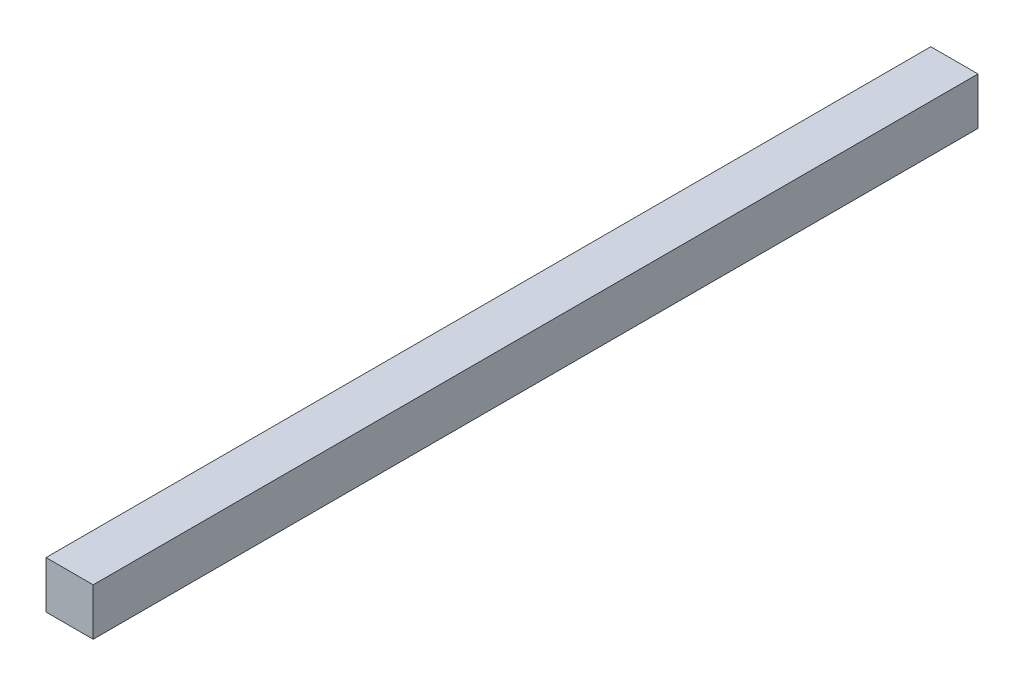
ISO-10303-21;
HEADER;
FILE_DESCRIPTION(('STEP AP214'),'2;1');
FILE_NAME('part.step','',(''),(''),'','','');
FILE_SCHEMA(('AUTOMOTIVE_DESIGN { 1 0 10303 214 1 1 1 1 }'));
ENDSEC;
DATA;
#1=APPLICATION_CONTEXT('core data for automotive mechanical design processes');
#2=APPLICATION_PROTOCOL_DEFINITION('international standard','automotive_design',2000,#1);
#3=PRODUCT_CONTEXT('',#1,'mechanical');
#4=PRODUCT('Part','Part','',(#3));
#5=PRODUCT_RELATED_PRODUCT_CATEGORY('part','',(#4));
#6=PRODUCT_DEFINITION_FORMATION('','',#4);
#7=PRODUCT_DEFINITION_CONTEXT('part definition',#1,'design');
#8=PRODUCT_DEFINITION('design','',#6,#7);
#9=PRODUCT_DEFINITION_SHAPE('','',#8);
#10=(LENGTH_UNIT() NAMED_UNIT(*) SI_UNIT(.MILLI.,.METRE.));
#11=(NAMED_UNIT(*) PLANE_ANGLE_UNIT() SI_UNIT($,.RADIAN.));
#12=(NAMED_UNIT(*) SI_UNIT($,.STERADIAN.) SOLID_ANGLE_UNIT());
#13=UNCERTAINTY_MEASURE_WITH_UNIT(LENGTH_MEASURE(1.E-05),#10,'distance_accuracy_value','');
#14=(GEOMETRIC_REPRESENTATION_CONTEXT(3) GLOBAL_UNCERTAINTY_ASSIGNED_CONTEXT((#13)) GLOBAL_UNIT_ASSIGNED_CONTEXT((#10,
#11,#12)) REPRESENTATION_CONTEXT('',''));
#15=CARTESIAN_POINT('',(0.,0.,0.));
#16=DIRECTION('',(0.,0.,1.));
#17=DIRECTION('',(1.,0.,0.));
#18=AXIS2_PLACEMENT_3D('',#15,#16,#17);
#19=CARTESIAN_POINT('',(25.4,-25.4,952.5));
#20=DIRECTION('',(-1.,0.,0.));
#21=DIRECTION('',(0.,0.,1.));
#22=AXIS2_PLACEMENT_3D('',#19,#20,#21);
#23=PLANE('',#22);
#24=DIRECTION('',(0.,1.,0.));
#25=VECTOR('',#24,1.);
#26=CARTESIAN_POINT('',(25.4,-25.4,0.));
#27=LINE('',#26,#25);
#28=CARTESIAN_POINT('',(25.4,-25.4,0.));
#29=VERTEX_POINT('',#28);
#30=CARTESIAN_POINT('',(25.4,25.4,0.));
#31=VERTEX_POINT('',#30);
#32=EDGE_CURVE('E111',#29,#31,#27,.T.);
#33=ORIENTED_EDGE('',*,*,#32,.T.);
#34=DIRECTION('',(0.,0.,-1.));
#35=VECTOR('',#34,1.);
#36=CARTESIAN_POINT('',(25.4,25.4,952.5));
#37=LINE('',#36,#35);
#38=CARTESIAN_POINT('',(25.4,25.4,952.5));
#39=VERTEX_POINT('',#38);
#40=EDGE_CURVE('E11',#39,#31,#37,.T.);
#41=ORIENTED_EDGE('',*,*,#40,.F.);
#42=DIRECTION('',(0.,1.,0.));
#43=VECTOR('',#42,1.);
#44=CARTESIAN_POINT('',(25.4,-25.4,952.5));
#45=LINE('',#44,#43);
#46=CARTESIAN_POINT('',(25.4,-25.4,952.5));
#47=VERTEX_POINT('',#46);
#48=EDGE_CURVE('E95',#47,#39,#45,.T.);
#49=ORIENTED_EDGE('',*,*,#48,.F.);
#50=DIRECTION('',(0.,0.,-1.));
#51=VECTOR('',#50,1.);
#52=CARTESIAN_POINT('',(25.4,-25.4,952.5));
#53=LINE('',#52,#51);
#54=EDGE_CURVE('E107',#47,#29,#53,.T.);
#55=ORIENTED_EDGE('',*,*,#54,.T.);
#56=EDGE_LOOP('',(#33,#41,#49,#55));
#57=FACE_BOUND('',#56,.T.);
#58=ADVANCED_FACE('F43',(#57),#23,.F.);
#59=CARTESIAN_POINT('',(-25.4,25.4,952.5));
#60=DIRECTION('',(0.,-1.,0.));
#61=DIRECTION('',(0.,0.,-1.));
#62=AXIS2_PLACEMENT_3D('',#59,#60,#61);
#63=PLANE('',#62);
#64=DIRECTION('',(-1.,0.,0.));
#65=VECTOR('',#64,1.);
#66=CARTESIAN_POINT('',(-25.4,25.4,0.));
#67=LINE('',#66,#65);
#68=CARTESIAN_POINT('',(-25.4,25.4,0.));
#69=VERTEX_POINT('',#68);
#70=EDGE_CURVE('E100',#31,#69,#67,.T.);
#71=ORIENTED_EDGE('',*,*,#70,.T.);
#72=DIRECTION('',(0.,0.,-1.));
#73=VECTOR('',#72,1.);
#74=CARTESIAN_POINT('',(-25.4,25.4,952.5));
#75=LINE('',#74,#73);
#76=CARTESIAN_POINT('',(-25.4,25.4,952.5));
#77=VERTEX_POINT('',#76);
#78=EDGE_CURVE('E52',#77,#69,#75,.T.);
#79=ORIENTED_EDGE('',*,*,#78,.F.);
#80=DIRECTION('',(-1.,0.,0.));
#81=VECTOR('',#80,1.);
#82=CARTESIAN_POINT('',(-25.4,25.4,952.5));
#83=LINE('',#82,#81);
#84=EDGE_CURVE('E90',#39,#77,#83,.T.);
#85=ORIENTED_EDGE('',*,*,#84,.F.);
#86=ORIENTED_EDGE('',*,*,#40,.T.);
#87=EDGE_LOOP('',(#71,#79,#85,#86));
#88=FACE_BOUND('',#87,.T.);
#89=ADVANCED_FACE('F99',(#88),#63,.F.);
#90=CARTESIAN_POINT('',(-25.4,-25.4,952.5));
#91=DIRECTION('',(1.,0.,0.));
#92=DIRECTION('',(0.,0.,-1.));
#93=AXIS2_PLACEMENT_3D('',#90,#91,#92);
#94=PLANE('',#93);
#95=DIRECTION('',(0.,-1.,0.));
#96=VECTOR('',#95,1.);
#97=CARTESIAN_POINT('',(-25.4,-25.4,0.));
#98=LINE('',#97,#96);
#99=CARTESIAN_POINT('',(-25.4,-25.4,0.));
#100=VERTEX_POINT('',#99);
#101=EDGE_CURVE('E77',#69,#100,#98,.T.);
#102=ORIENTED_EDGE('',*,*,#101,.T.);
#103=DIRECTION('',(0.,0.,-1.));
#104=VECTOR('',#103,1.);
#105=CARTESIAN_POINT('',(-25.4,-25.4,952.5));
#106=LINE('',#105,#104);
#107=CARTESIAN_POINT('',(-25.4,-25.4,952.5));
#108=VERTEX_POINT('',#107);
#109=EDGE_CURVE('E102',#108,#100,#106,.T.);
#110=ORIENTED_EDGE('',*,*,#109,.F.);
#111=DIRECTION('',(0.,-1.,0.));
#112=VECTOR('',#111,1.);
#113=CARTESIAN_POINT('',(-25.4,-25.4,952.5));
#114=LINE('',#113,#112);
#115=EDGE_CURVE('E93',#77,#108,#114,.T.);
#116=ORIENTED_EDGE('',*,*,#115,.F.);
#117=ORIENTED_EDGE('',*,*,#78,.T.);
#118=EDGE_LOOP('',(#102,#110,#116,#117));
#119=FACE_BOUND('',#118,.T.);
#120=ADVANCED_FACE('F103',(#119),#94,.F.);
#121=CARTESIAN_POINT('',(-25.4,-25.4,952.5));
#122=DIRECTION('',(0.,1.,0.));
#123=DIRECTION('',(0.,0.,1.));
#124=AXIS2_PLACEMENT_3D('',#121,#122,#123);
#125=PLANE('',#124);
#126=DIRECTION('',(1.,0.,0.));
#127=VECTOR('',#126,1.);
#128=CARTESIAN_POINT('',(-25.4,-25.4,0.));
#129=LINE('',#128,#127);
#130=EDGE_CURVE('E83',#100,#29,#129,.T.);
#131=ORIENTED_EDGE('',*,*,#130,.T.);
#132=ORIENTED_EDGE('',*,*,#54,.F.);
#133=DIRECTION('',(1.,0.,0.));
#134=VECTOR('',#133,1.);
#135=CARTESIAN_POINT('',(-25.4,-25.4,952.5));
#136=LINE('',#135,#134);
#137=EDGE_CURVE('E60',#108,#47,#136,.T.);
#138=ORIENTED_EDGE('',*,*,#137,.F.);
#139=ORIENTED_EDGE('',*,*,#109,.T.);
#140=EDGE_LOOP('',(#131,#132,#138,#139));
#141=FACE_BOUND('',#140,.T.);
#142=ADVANCED_FACE('F124',(#141),#125,.F.);
#143=CARTESIAN_POINT('',(0.,0.,952.5));
#144=DIRECTION('',(0.,0.,-1.));
#145=DIRECTION('',(-1.,0.,0.));
#146=AXIS2_PLACEMENT_3D('',#143,#144,#145);
#147=PLANE('',#146);
#148=ORIENTED_EDGE('',*,*,#48,.T.);
#149=ORIENTED_EDGE('',*,*,#84,.T.);
#150=ORIENTED_EDGE('',*,*,#115,.T.);
#151=ORIENTED_EDGE('',*,*,#137,.T.);
#152=EDGE_LOOP('',(#148,#149,#150,#151));
#153=FACE_BOUND('',#152,.T.);
#154=ADVANCED_FACE('F91',(#153),#147,.F.);
#155=CARTESIAN_POINT('',(0.,0.,0.));
#156=DIRECTION('',(0.,0.,-1.));
#157=DIRECTION('',(-1.,0.,0.));
#158=AXIS2_PLACEMENT_3D('',#155,#156,#157);
#159=PLANE('',#158);
#160=ORIENTED_EDGE('',*,*,#32,.F.);
#161=ORIENTED_EDGE('',*,*,#130,.F.);
#162=ORIENTED_EDGE('',*,*,#101,.F.);
#163=ORIENTED_EDGE('',*,*,#70,.F.);
#164=EDGE_LOOP('',(#160,#161,#162,#163));
#165=FACE_BOUND('',#164,.T.);
#166=ADVANCED_FACE('F127',(#165),#159,.T.);
#167=CLOSED_SHELL('',(#58,#89,#120,#142,#154,#166));
#168=MANIFOLD_SOLID_BREP('B2',#167);
#169=ADVANCED_BREP_SHAPE_REPRESENTATION('',(#18,#168),#14);
#170=SHAPE_DEFINITION_REPRESENTATION(#9,#169);
ENDSEC;
END-ISO-10303-21;
